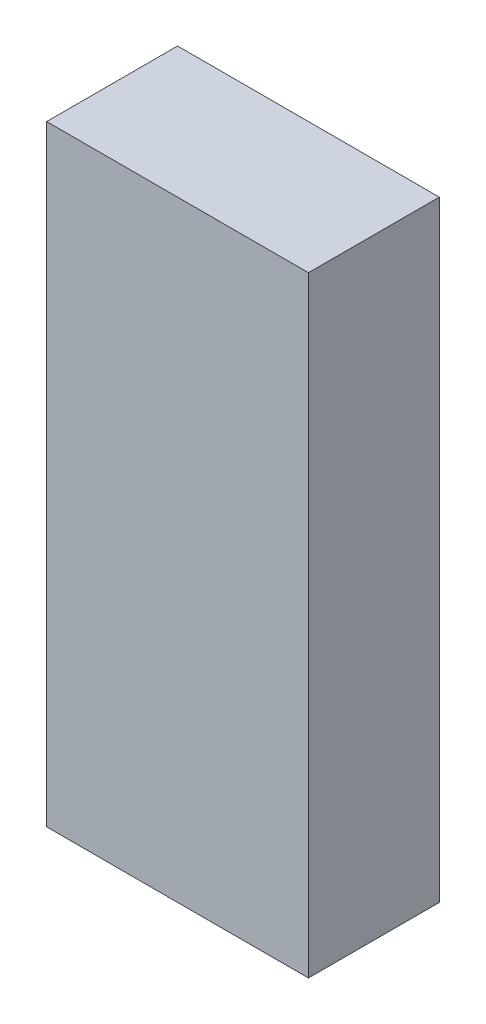
ISO-10303-21;
HEADER;
FILE_DESCRIPTION(('STEP AP214'),'2;1');
FILE_NAME('part.step','',(''),(''),'','','');
FILE_SCHEMA(('AUTOMOTIVE_DESIGN { 1 0 10303 214 1 1 1 1 }'));
ENDSEC;
DATA;
#1=APPLICATION_CONTEXT('core data for automotive mechanical design processes');
#2=APPLICATION_PROTOCOL_DEFINITION('international standard','automotive_design',2000,#1);
#3=PRODUCT_CONTEXT('',#1,'mechanical');
#4=PRODUCT('Part','Part','',(#3));
#5=PRODUCT_RELATED_PRODUCT_CATEGORY('part','',(#4));
#6=PRODUCT_DEFINITION_FORMATION('','',#4);
#7=PRODUCT_DEFINITION_CONTEXT('part definition',#1,'design');
#8=PRODUCT_DEFINITION('design','',#6,#7);
#9=PRODUCT_DEFINITION_SHAPE('','',#8);
#10=(LENGTH_UNIT() NAMED_UNIT(*) SI_UNIT(.MILLI.,.METRE.));
#11=(NAMED_UNIT(*) PLANE_ANGLE_UNIT() SI_UNIT($,.RADIAN.));
#12=(NAMED_UNIT(*) SI_UNIT($,.STERADIAN.) SOLID_ANGLE_UNIT());
#13=UNCERTAINTY_MEASURE_WITH_UNIT(LENGTH_MEASURE(1.E-05),#10,'distance_accuracy_value','');
#14=(GEOMETRIC_REPRESENTATION_CONTEXT(3) GLOBAL_UNCERTAINTY_ASSIGNED_CONTEXT((#13)) GLOBAL_UNIT_ASSIGNED_CONTEXT((#10,
#11,#12)) REPRESENTATION_CONTEXT('',''));
#15=CARTESIAN_POINT('',(0.,0.,0.));
#16=DIRECTION('',(0.,0.,1.));
#17=DIRECTION('',(1.,0.,0.));
#18=AXIS2_PLACEMENT_3D('',#15,#16,#17);
#19=CARTESIAN_POINT('',(38.1,177.8,19.05));
#20=DIRECTION('',(-1.,0.,0.));
#21=DIRECTION('',(0.,0.,1.));
#22=AXIS2_PLACEMENT_3D('',#19,#20,#21);
#23=PLANE('',#22);
#24=DIRECTION('',(0.,0.,-1.));
#25=VECTOR('',#24,1.);
#26=CARTESIAN_POINT('',(38.1,0.,19.05));
#27=LINE('',#26,#25);
#28=CARTESIAN_POINT('',(38.1,0.,19.05));
#29=VERTEX_POINT('',#28);
#30=CARTESIAN_POINT('',(38.1,0.,-19.05));
#31=VERTEX_POINT('',#30);
#32=EDGE_CURVE('E96',#29,#31,#27,.T.);
#33=ORIENTED_EDGE('',*,*,#32,.T.);
#34=DIRECTION('',(0.,-1.,0.));
#35=VECTOR('',#34,1.);
#36=CARTESIAN_POINT('',(38.1,177.8,-19.05));
#37=LINE('',#36,#35);
#38=CARTESIAN_POINT('',(38.1,177.8,-19.05));
#39=VERTEX_POINT('',#38);
#40=EDGE_CURVE('E11',#39,#31,#37,.T.);
#41=ORIENTED_EDGE('',*,*,#40,.F.);
#42=DIRECTION('',(0.,0.,-1.));
#43=VECTOR('',#42,1.);
#44=CARTESIAN_POINT('',(38.1,177.8,19.05));
#45=LINE('',#44,#43);
#46=CARTESIAN_POINT('',(38.1,177.8,19.05));
#47=VERTEX_POINT('',#46);
#48=EDGE_CURVE('E84',#47,#39,#45,.T.);
#49=ORIENTED_EDGE('',*,*,#48,.F.);
#50=DIRECTION('',(0.,-1.,0.));
#51=VECTOR('',#50,1.);
#52=CARTESIAN_POINT('',(38.1,177.8,19.05));
#53=LINE('',#52,#51);
#54=EDGE_CURVE('E92',#47,#29,#53,.T.);
#55=ORIENTED_EDGE('',*,*,#54,.T.);
#56=EDGE_LOOP('',(#33,#41,#49,#55));
#57=FACE_BOUND('',#56,.T.);
#58=ADVANCED_FACE('F33',(#57),#23,.F.);
#59=CARTESIAN_POINT('',(-38.1,177.8,-19.05));
#60=DIRECTION('',(0.,0.,1.));
#61=DIRECTION('',(1.,0.,0.));
#62=AXIS2_PLACEMENT_3D('',#59,#60,#61);
#63=PLANE('',#62);
#64=DIRECTION('',(-1.,0.,0.));
#65=VECTOR('',#64,1.);
#66=CARTESIAN_POINT('',(-38.1,0.,-19.05));
#67=LINE('',#66,#65);
#68=CARTESIAN_POINT('',(-38.1,0.,-19.05));
#69=VERTEX_POINT('',#68);
#70=EDGE_CURVE('E88',#31,#69,#67,.T.);
#71=ORIENTED_EDGE('',*,*,#70,.T.);
#72=DIRECTION('',(0.,-1.,0.));
#73=VECTOR('',#72,1.);
#74=CARTESIAN_POINT('',(-38.1,177.8,-19.05));
#75=LINE('',#74,#73);
#76=CARTESIAN_POINT('',(-38.1,177.8,-19.05));
#77=VERTEX_POINT('',#76);
#78=EDGE_CURVE('E41',#77,#69,#75,.T.);
#79=ORIENTED_EDGE('',*,*,#78,.F.);
#80=DIRECTION('',(-1.,0.,0.));
#81=VECTOR('',#80,1.);
#82=CARTESIAN_POINT('',(-38.1,177.8,-19.05));
#83=LINE('',#82,#81);
#84=EDGE_CURVE('E79',#39,#77,#83,.T.);
#85=ORIENTED_EDGE('',*,*,#84,.F.);
#86=ORIENTED_EDGE('',*,*,#40,.T.);
#87=EDGE_LOOP('',(#71,#79,#85,#86));
#88=FACE_BOUND('',#87,.T.);
#89=ADVANCED_FACE('F87',(#88),#63,.F.);
#90=CARTESIAN_POINT('',(-38.1,177.8,19.05));
#91=DIRECTION('',(1.,0.,0.));
#92=DIRECTION('',(0.,0.,-1.));
#93=AXIS2_PLACEMENT_3D('',#90,#91,#92);
#94=PLANE('',#93);
#95=DIRECTION('',(0.,0.,1.));
#96=VECTOR('',#95,1.);
#97=CARTESIAN_POINT('',(-38.1,0.,19.05));
#98=LINE('',#97,#96);
#99=CARTESIAN_POINT('',(-38.1,0.,19.05));
#100=VERTEX_POINT('',#99);
#101=EDGE_CURVE('E66',#69,#100,#98,.T.);
#102=ORIENTED_EDGE('',*,*,#101,.T.);
#103=DIRECTION('',(0.,-1.,0.));
#104=VECTOR('',#103,1.);
#105=CARTESIAN_POINT('',(-38.1,177.8,19.05));
#106=LINE('',#105,#104);
#107=CARTESIAN_POINT('',(-38.1,177.8,19.05));
#108=VERTEX_POINT('',#107);
#109=EDGE_CURVE('E89',#108,#100,#106,.T.);
#110=ORIENTED_EDGE('',*,*,#109,.F.);
#111=DIRECTION('',(0.,0.,1.));
#112=VECTOR('',#111,1.);
#113=CARTESIAN_POINT('',(-38.1,177.8,19.05));
#114=LINE('',#113,#112);
#115=EDGE_CURVE('E82',#77,#108,#114,.T.);
#116=ORIENTED_EDGE('',*,*,#115,.F.);
#117=ORIENTED_EDGE('',*,*,#78,.T.);
#118=EDGE_LOOP('',(#102,#110,#116,#117));
#119=FACE_BOUND('',#118,.T.);
#120=ADVANCED_FACE('F90',(#119),#94,.F.);
#121=CARTESIAN_POINT('',(-38.1,177.8,19.05));
#122=DIRECTION('',(0.,0.,-1.));
#123=DIRECTION('',(-1.,0.,0.));
#124=AXIS2_PLACEMENT_3D('',#121,#122,#123);
#125=PLANE('',#124);
#126=DIRECTION('',(1.,0.,0.));
#127=VECTOR('',#126,1.);
#128=CARTESIAN_POINT('',(-38.1,0.,19.05));
#129=LINE('',#128,#127);
#130=EDGE_CURVE('E72',#100,#29,#129,.T.);
#131=ORIENTED_EDGE('',*,*,#130,.T.);
#132=ORIENTED_EDGE('',*,*,#54,.F.);
#133=DIRECTION('',(1.,0.,0.));
#134=VECTOR('',#133,1.);
#135=CARTESIAN_POINT('',(-38.1,177.8,19.05));
#136=LINE('',#135,#134);
#137=EDGE_CURVE('E49',#108,#47,#136,.T.);
#138=ORIENTED_EDGE('',*,*,#137,.F.);
#139=ORIENTED_EDGE('',*,*,#109,.T.);
#140=EDGE_LOOP('',(#131,#132,#138,#139));
#141=FACE_BOUND('',#140,.T.);
#142=ADVANCED_FACE('F103',(#141),#125,.F.);
#143=CARTESIAN_POINT('',(0.,177.8,0.));
#144=DIRECTION('',(0.,-1.,0.));
#145=DIRECTION('',(0.,0.,-1.));
#146=AXIS2_PLACEMENT_3D('',#143,#144,#145);
#147=PLANE('',#146);
#148=ORIENTED_EDGE('',*,*,#48,.T.);
#149=ORIENTED_EDGE('',*,*,#84,.T.);
#150=ORIENTED_EDGE('',*,*,#115,.T.);
#151=ORIENTED_EDGE('',*,*,#137,.T.);
#152=EDGE_LOOP('',(#148,#149,#150,#151));
#153=FACE_BOUND('',#152,.T.);
#154=ADVANCED_FACE('F80',(#153),#147,.F.);
#155=CARTESIAN_POINT('',(0.,0.,0.));
#156=DIRECTION('',(0.,-1.,0.));
#157=DIRECTION('',(0.,0.,-1.));
#158=AXIS2_PLACEMENT_3D('',#155,#156,#157);
#159=PLANE('',#158);
#160=ORIENTED_EDGE('',*,*,#32,.F.);
#161=ORIENTED_EDGE('',*,*,#130,.F.);
#162=ORIENTED_EDGE('',*,*,#101,.F.);
#163=ORIENTED_EDGE('',*,*,#70,.F.);
#164=EDGE_LOOP('',(#160,#161,#162,#163));
#165=FACE_BOUND('',#164,.T.);
#166=ADVANCED_FACE('F106',(#165),#159,.T.);
#167=CLOSED_SHELL('',(#58,#89,#120,#142,#154,#166));
#168=MANIFOLD_SOLID_BREP('B2',#167);
#169=ADVANCED_BREP_SHAPE_REPRESENTATION('',(#18,#168),#14);
#170=SHAPE_DEFINITION_REPRESENTATION(#9,#169);
ENDSEC;
END-ISO-10303-21;
